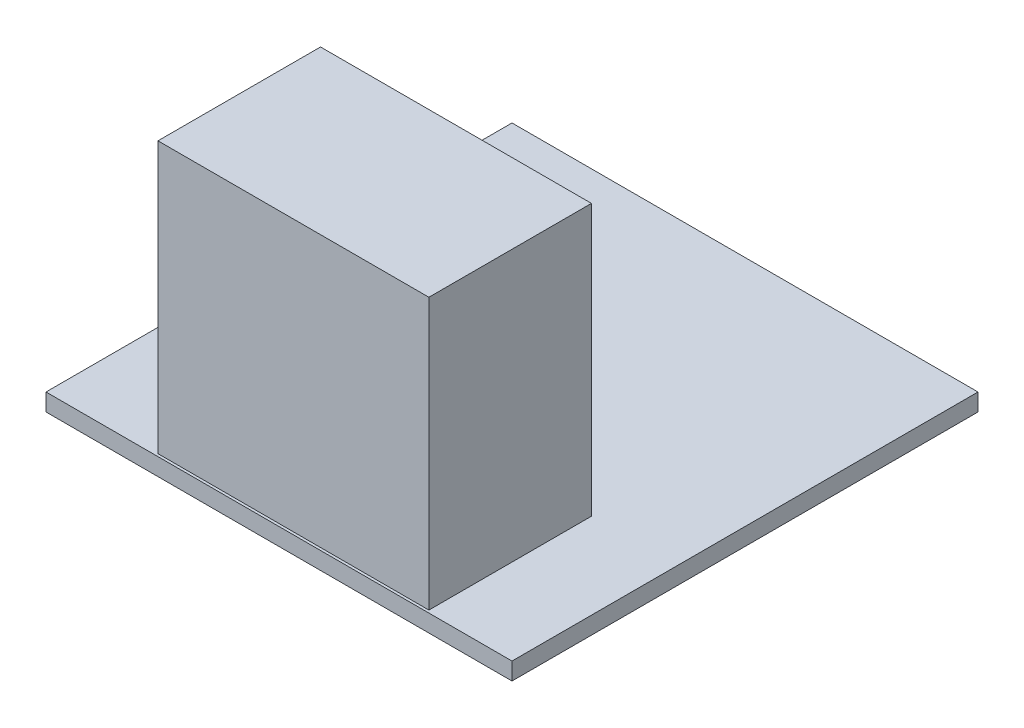
ISO-10303-21;
HEADER;
FILE_DESCRIPTION(('STEP AP214'),'2;1');
FILE_NAME('part.step','',(''),(''),'','','');
FILE_SCHEMA(('AUTOMOTIVE_DESIGN { 1 0 10303 214 1 1 1 1 }'));
ENDSEC;
DATA;
#1=APPLICATION_CONTEXT('core data for automotive mechanical design processes');
#2=APPLICATION_PROTOCOL_DEFINITION('international standard','automotive_design',2000,#1);
#3=PRODUCT_CONTEXT('',#1,'mechanical');
#4=PRODUCT('Part','Part','',(#3));
#5=PRODUCT_RELATED_PRODUCT_CATEGORY('part','',(#4));
#6=PRODUCT_DEFINITION_FORMATION('','',#4);
#7=PRODUCT_DEFINITION_CONTEXT('part definition',#1,'design');
#8=PRODUCT_DEFINITION('design','',#6,#7);
#9=PRODUCT_DEFINITION_SHAPE('','',#8);
#10=(LENGTH_UNIT() NAMED_UNIT(*) SI_UNIT(.MILLI.,.METRE.));
#11=(NAMED_UNIT(*) PLANE_ANGLE_UNIT() SI_UNIT($,.RADIAN.));
#12=(NAMED_UNIT(*) SI_UNIT($,.STERADIAN.) SOLID_ANGLE_UNIT());
#13=UNCERTAINTY_MEASURE_WITH_UNIT(LENGTH_MEASURE(1.E-05),#10,'distance_accuracy_value','');
#14=(GEOMETRIC_REPRESENTATION_CONTEXT(3) GLOBAL_UNCERTAINTY_ASSIGNED_CONTEXT((#13)) GLOBAL_UNIT_ASSIGNED_CONTEXT((#10,
#11,#12)) REPRESENTATION_CONTEXT('',''));
#15=CARTESIAN_POINT('',(0.,0.,0.));
#16=DIRECTION('',(0.,0.,1.));
#17=DIRECTION('',(1.,0.,0.));
#18=AXIS2_PLACEMENT_3D('',#15,#16,#17);
#19=CARTESIAN_POINT('',(0.,1.6,0.));
#20=DIRECTION('',(0.,-1.,0.));
#21=DIRECTION('',(0.,0.,-1.));
#22=AXIS2_PLACEMENT_3D('',#19,#20,#21);
#23=PLANE('',#22);
#24=DIRECTION('',(0.,0.,1.));
#25=VECTOR('',#24,1.);
#26=CARTESIAN_POINT('',(0.,1.6,0.));
#27=LINE('',#26,#25);
#28=CARTESIAN_POINT('',(0.,1.6,-43.));
#29=VERTEX_POINT('',#28);
#30=CARTESIAN_POINT('',(0.,1.6,0.));
#31=VERTEX_POINT('',#30);
#32=EDGE_CURVE('E128',#29,#31,#27,.T.);
#33=ORIENTED_EDGE('',*,*,#32,.T.);
#34=DIRECTION('',(1.,0.,0.));
#35=VECTOR('',#34,1.);
#36=CARTESIAN_POINT('',(0.,1.6,0.));
#37=LINE('',#36,#35);
#38=CARTESIAN_POINT('',(43.,1.6,0.));
#39=VERTEX_POINT('',#38);
#40=EDGE_CURVE('E131',#31,#39,#37,.T.);
#41=ORIENTED_EDGE('',*,*,#40,.T.);
#42=DIRECTION('',(0.,0.,-1.));
#43=VECTOR('',#42,1.);
#44=CARTESIAN_POINT('',(43.,1.6,0.));
#45=LINE('',#44,#43);
#46=CARTESIAN_POINT('',(43.,1.6,-43.));
#47=VERTEX_POINT('',#46);
#48=EDGE_CURVE('E134',#39,#47,#45,.T.);
#49=ORIENTED_EDGE('',*,*,#48,.T.);
#50=DIRECTION('',(-1.,0.,0.));
#51=VECTOR('',#50,1.);
#52=CARTESIAN_POINT('',(0.,1.6,-43.));
#53=LINE('',#52,#51);
#54=EDGE_CURVE('E136',#47,#29,#53,.T.);
#55=ORIENTED_EDGE('',*,*,#54,.T.);
#56=EDGE_LOOP('',(#33,#41,#49,#55));
#57=FACE_BOUND('',#56,.T.);
#58=DIRECTION('',(0.,0.,1.));
#59=VECTOR('',#58,1.);
#60=CARTESIAN_POINT('',(10.0944990838059,1.6,-0.236979321458357));
#61=LINE('',#60,#59);
#62=CARTESIAN_POINT('',(10.0944990838059,1.6,-15.2369793214584));
#63=VERTEX_POINT('',#62);
#64=CARTESIAN_POINT('',(10.0944990838059,1.6,-0.236979321458357));
#65=VERTEX_POINT('',#64);
#66=EDGE_CURVE('E118',#63,#65,#61,.T.);
#67=ORIENTED_EDGE('',*,*,#66,.F.);
#68=DIRECTION('',(-1.,0.,0.));
#69=VECTOR('',#68,1.);
#70=CARTESIAN_POINT('',(10.0944990838059,1.6,-15.2369793214584));
#71=LINE('',#70,#69);
#72=CARTESIAN_POINT('',(35.0944990838059,1.6,-15.2369793214584));
#73=VERTEX_POINT('',#72);
#74=EDGE_CURVE('E115',#73,#63,#71,.T.);
#75=ORIENTED_EDGE('',*,*,#74,.F.);
#76=DIRECTION('',(0.,0.,-1.));
#77=VECTOR('',#76,1.);
#78=CARTESIAN_POINT('',(35.0944990838059,1.6,-0.236979321458357));
#79=LINE('',#78,#77);
#80=CARTESIAN_POINT('',(35.0944990838059,1.6,-0.236979321458357));
#81=VERTEX_POINT('',#80);
#82=EDGE_CURVE('E53',#81,#73,#79,.T.);
#83=ORIENTED_EDGE('',*,*,#82,.F.);
#84=DIRECTION('',(1.,0.,0.));
#85=VECTOR('',#84,1.);
#86=CARTESIAN_POINT('',(10.0944990838059,1.6,-0.236979321458357));
#87=LINE('',#86,#85);
#88=EDGE_CURVE('E48',#65,#81,#87,.T.);
#89=ORIENTED_EDGE('',*,*,#88,.F.);
#90=EDGE_LOOP('',(#67,#75,#83,#89));
#91=FACE_BOUND('',#90,.T.);
#92=ADVANCED_FACE('F33',(#57,#91),#23,.F.);
#93=CARTESIAN_POINT('',(0.,1.6,0.));
#94=DIRECTION('',(1.,0.,0.));
#95=DIRECTION('',(0.,0.,-1.));
#96=AXIS2_PLACEMENT_3D('',#93,#94,#95);
#97=PLANE('',#96);
#98=DIRECTION('',(0.,0.,1.));
#99=VECTOR('',#98,1.);
#100=CARTESIAN_POINT('',(0.,0.,0.));
#101=LINE('',#100,#99);
#102=CARTESIAN_POINT('',(0.,0.,-43.));
#103=VERTEX_POINT('',#102);
#104=CARTESIAN_POINT('',(0.,0.,0.));
#105=VERTEX_POINT('',#104);
#106=EDGE_CURVE('E119',#103,#105,#101,.T.);
#107=ORIENTED_EDGE('',*,*,#106,.T.);
#108=DIRECTION('',(0.,-1.,0.));
#109=VECTOR('',#108,1.);
#110=CARTESIAN_POINT('',(0.,1.6,0.));
#111=LINE('',#110,#109);
#112=EDGE_CURVE('E11',#31,#105,#111,.T.);
#113=ORIENTED_EDGE('',*,*,#112,.F.);
#114=ORIENTED_EDGE('',*,*,#32,.F.);
#115=DIRECTION('',(0.,-1.,0.));
#116=VECTOR('',#115,1.);
#117=CARTESIAN_POINT('',(0.,1.6,-43.));
#118=LINE('',#117,#116);
#119=EDGE_CURVE('E137',#29,#103,#118,.T.);
#120=ORIENTED_EDGE('',*,*,#119,.T.);
#121=EDGE_LOOP('',(#107,#113,#114,#120));
#122=FACE_BOUND('',#121,.T.);
#123=ADVANCED_FACE('F35',(#122),#97,.F.);
#124=CARTESIAN_POINT('',(0.,1.6,0.));
#125=DIRECTION('',(0.,0.,-1.));
#126=DIRECTION('',(-1.,0.,0.));
#127=AXIS2_PLACEMENT_3D('',#124,#125,#126);
#128=PLANE('',#127);
#129=DIRECTION('',(1.,0.,0.));
#130=VECTOR('',#129,1.);
#131=CARTESIAN_POINT('',(0.,0.,0.));
#132=LINE('',#131,#130);
#133=CARTESIAN_POINT('',(43.,0.,0.));
#134=VERTEX_POINT('',#133);
#135=EDGE_CURVE('E122',#105,#134,#132,.T.);
#136=ORIENTED_EDGE('',*,*,#135,.T.);
#137=DIRECTION('',(0.,-1.,0.));
#138=VECTOR('',#137,1.);
#139=CARTESIAN_POINT('',(43.,1.6,0.));
#140=LINE('',#139,#138);
#141=EDGE_CURVE('E41',#39,#134,#140,.T.);
#142=ORIENTED_EDGE('',*,*,#141,.F.);
#143=ORIENTED_EDGE('',*,*,#40,.F.);
#144=ORIENTED_EDGE('',*,*,#112,.T.);
#145=EDGE_LOOP('',(#136,#142,#143,#144));
#146=FACE_BOUND('',#145,.T.);
#147=ADVANCED_FACE('F167',(#146),#128,.F.);
#148=CARTESIAN_POINT('',(43.,1.6,0.));
#149=DIRECTION('',(-1.,0.,0.));
#150=DIRECTION('',(0.,0.,1.));
#151=AXIS2_PLACEMENT_3D('',#148,#149,#150);
#152=PLANE('',#151);
#153=DIRECTION('',(0.,0.,-1.));
#154=VECTOR('',#153,1.);
#155=CARTESIAN_POINT('',(43.,0.,0.));
#156=LINE('',#155,#154);
#157=CARTESIAN_POINT('',(43.,0.,-43.));
#158=VERTEX_POINT('',#157);
#159=EDGE_CURVE('E140',#134,#158,#156,.T.);
#160=ORIENTED_EDGE('',*,*,#159,.T.);
#161=DIRECTION('',(0.,-1.,0.));
#162=VECTOR('',#161,1.);
#163=CARTESIAN_POINT('',(43.,1.6,-43.));
#164=LINE('',#163,#162);
#165=EDGE_CURVE('E145',#47,#158,#164,.T.);
#166=ORIENTED_EDGE('',*,*,#165,.F.);
#167=ORIENTED_EDGE('',*,*,#48,.F.);
#168=ORIENTED_EDGE('',*,*,#141,.T.);
#169=EDGE_LOOP('',(#160,#166,#167,#168));
#170=FACE_BOUND('',#169,.T.);
#171=ADVANCED_FACE('F152',(#170),#152,.F.);
#172=CARTESIAN_POINT('',(0.,1.6,-43.));
#173=DIRECTION('',(0.,0.,1.));
#174=DIRECTION('',(1.,0.,0.));
#175=AXIS2_PLACEMENT_3D('',#172,#173,#174);
#176=PLANE('',#175);
#177=DIRECTION('',(-1.,0.,0.));
#178=VECTOR('',#177,1.);
#179=CARTESIAN_POINT('',(0.,0.,-43.));
#180=LINE('',#179,#178);
#181=EDGE_CURVE('E132',#158,#103,#180,.T.);
#182=ORIENTED_EDGE('',*,*,#181,.T.);
#183=ORIENTED_EDGE('',*,*,#119,.F.);
#184=ORIENTED_EDGE('',*,*,#54,.F.);
#185=ORIENTED_EDGE('',*,*,#165,.T.);
#186=EDGE_LOOP('',(#182,#183,#184,#185));
#187=FACE_BOUND('',#186,.T.);
#188=ADVANCED_FACE('F161',(#187),#176,.F.);
#189=CARTESIAN_POINT('',(0.,0.,0.));
#190=DIRECTION('',(0.,-1.,0.));
#191=DIRECTION('',(0.,0.,-1.));
#192=AXIS2_PLACEMENT_3D('',#189,#190,#191);
#193=PLANE('',#192);
#194=ORIENTED_EDGE('',*,*,#106,.F.);
#195=ORIENTED_EDGE('',*,*,#181,.F.);
#196=ORIENTED_EDGE('',*,*,#159,.F.);
#197=ORIENTED_EDGE('',*,*,#135,.F.);
#198=EDGE_LOOP('',(#194,#195,#196,#197));
#199=FACE_BOUND('',#198,.T.);
#200=ADVANCED_FACE('F158',(#199),#193,.T.);
#201=CARTESIAN_POINT('',(10.0944990838059,26.6,-0.236979321458357));
#202=DIRECTION('',(1.,0.,0.));
#203=DIRECTION('',(0.,0.,-1.));
#204=AXIS2_PLACEMENT_3D('',#201,#202,#203);
#205=PLANE('',#204);
#206=ORIENTED_EDGE('',*,*,#66,.T.);
#207=DIRECTION('',(0.,-1.,0.));
#208=VECTOR('',#207,1.);
#209=CARTESIAN_POINT('',(10.0944990838059,26.6,-0.236979321458357));
#210=LINE('',#209,#208);
#211=CARTESIAN_POINT('',(10.0944990838059,26.6,-0.236979321458357));
#212=VERTEX_POINT('',#211);
#213=EDGE_CURVE('E99',#212,#65,#210,.T.);
#214=ORIENTED_EDGE('',*,*,#213,.F.);
#215=DIRECTION('',(0.,0.,1.));
#216=VECTOR('',#215,1.);
#217=CARTESIAN_POINT('',(10.0944990838059,26.6,-0.236979321458357));
#218=LINE('',#217,#216);
#219=CARTESIAN_POINT('',(10.0944990838059,26.6,-15.2369793214584));
#220=VERTEX_POINT('',#219);
#221=EDGE_CURVE('E106',#220,#212,#218,.T.);
#222=ORIENTED_EDGE('',*,*,#221,.F.);
#223=DIRECTION('',(0.,-1.,0.));
#224=VECTOR('',#223,1.);
#225=CARTESIAN_POINT('',(10.0944990838059,26.6,-15.2369793214584));
#226=LINE('',#225,#224);
#227=EDGE_CURVE('E260',#220,#63,#226,.T.);
#228=ORIENTED_EDGE('',*,*,#227,.T.);
#229=EDGE_LOOP('',(#206,#214,#222,#228));
#230=FACE_BOUND('',#229,.T.);
#231=ADVANCED_FACE('F117',(#230),#205,.F.);
#232=CARTESIAN_POINT('',(10.0944990838059,26.6,-0.236979321458357));
#233=DIRECTION('',(0.,0.,-1.));
#234=DIRECTION('',(-1.,0.,0.));
#235=AXIS2_PLACEMENT_3D('',#232,#233,#234);
#236=PLANE('',#235);
#237=ORIENTED_EDGE('',*,*,#88,.T.);
#238=DIRECTION('',(0.,-1.,0.));
#239=VECTOR('',#238,1.);
#240=CARTESIAN_POINT('',(35.0944990838059,26.6,-0.236979321458357));
#241=LINE('',#240,#239);
#242=CARTESIAN_POINT('',(35.0944990838059,26.6,-0.236979321458357));
#243=VERTEX_POINT('',#242);
#244=EDGE_CURVE('E102',#243,#81,#241,.T.);
#245=ORIENTED_EDGE('',*,*,#244,.F.);
#246=DIRECTION('',(1.,0.,0.));
#247=VECTOR('',#246,1.);
#248=CARTESIAN_POINT('',(10.0944990838059,26.6,-0.236979321458357));
#249=LINE('',#248,#247);
#250=EDGE_CURVE('E95',#212,#243,#249,.T.);
#251=ORIENTED_EDGE('',*,*,#250,.F.);
#252=ORIENTED_EDGE('',*,*,#213,.T.);
#253=EDGE_LOOP('',(#237,#245,#251,#252));
#254=FACE_BOUND('',#253,.T.);
#255=ADVANCED_FACE('F97',(#254),#236,.F.);
#256=CARTESIAN_POINT('',(35.0944990838059,26.6,-0.236979321458357));
#257=DIRECTION('',(-1.,0.,0.));
#258=DIRECTION('',(0.,0.,1.));
#259=AXIS2_PLACEMENT_3D('',#256,#257,#258);
#260=PLANE('',#259);
#261=ORIENTED_EDGE('',*,*,#82,.T.);
#262=DIRECTION('',(0.,-1.,0.));
#263=VECTOR('',#262,1.);
#264=CARTESIAN_POINT('',(35.0944990838059,26.6,-15.2369793214584));
#265=LINE('',#264,#263);
#266=CARTESIAN_POINT('',(35.0944990838059,26.6,-15.2369793214584));
#267=VERTEX_POINT('',#266);
#268=EDGE_CURVE('E124',#267,#73,#265,.T.);
#269=ORIENTED_EDGE('',*,*,#268,.F.);
#270=DIRECTION('',(0.,0.,-1.));
#271=VECTOR('',#270,1.);
#272=CARTESIAN_POINT('',(35.0944990838059,26.6,-0.236979321458357));
#273=LINE('',#272,#271);
#274=EDGE_CURVE('E105',#243,#267,#273,.T.);
#275=ORIENTED_EDGE('',*,*,#274,.F.);
#276=ORIENTED_EDGE('',*,*,#244,.T.);
#277=EDGE_LOOP('',(#261,#269,#275,#276));
#278=FACE_BOUND('',#277,.T.);
#279=ADVANCED_FACE('F203',(#278),#260,.F.);
#280=CARTESIAN_POINT('',(10.0944990838059,26.6,-15.2369793214584));
#281=DIRECTION('',(0.,0.,1.));
#282=DIRECTION('',(1.,0.,0.));
#283=AXIS2_PLACEMENT_3D('',#280,#281,#282);
#284=PLANE('',#283);
#285=ORIENTED_EDGE('',*,*,#74,.T.);
#286=ORIENTED_EDGE('',*,*,#227,.F.);
#287=DIRECTION('',(-1.,0.,0.));
#288=VECTOR('',#287,1.);
#289=CARTESIAN_POINT('',(10.0944990838059,26.6,-15.2369793214584));
#290=LINE('',#289,#288);
#291=EDGE_CURVE('E111',#267,#220,#290,.T.);
#292=ORIENTED_EDGE('',*,*,#291,.F.);
#293=ORIENTED_EDGE('',*,*,#268,.T.);
#294=EDGE_LOOP('',(#285,#286,#292,#293));
#295=FACE_BOUND('',#294,.T.);
#296=ADVANCED_FACE('F209',(#295),#284,.F.);
#297=CARTESIAN_POINT('',(0.,26.6,0.));
#298=DIRECTION('',(0.,-1.,0.));
#299=DIRECTION('',(0.,0.,-1.));
#300=AXIS2_PLACEMENT_3D('',#297,#298,#299);
#301=PLANE('',#300);
#302=ORIENTED_EDGE('',*,*,#221,.T.);
#303=ORIENTED_EDGE('',*,*,#250,.T.);
#304=ORIENTED_EDGE('',*,*,#274,.T.);
#305=ORIENTED_EDGE('',*,*,#291,.T.);
#306=EDGE_LOOP('',(#302,#303,#304,#305));
#307=FACE_BOUND('',#306,.T.);
#308=ADVANCED_FACE('F109',(#307),#301,.F.);
#309=CLOSED_SHELL('',(#92,#123,#147,#171,#188,#200,#231,#255,#279,#296,#308));
#310=MANIFOLD_SOLID_BREP('B2',#309);
#311=ADVANCED_BREP_SHAPE_REPRESENTATION('',(#18,#310),#14);
#312=SHAPE_DEFINITION_REPRESENTATION(#9,#311);
ENDSEC;
END-ISO-10303-21;
